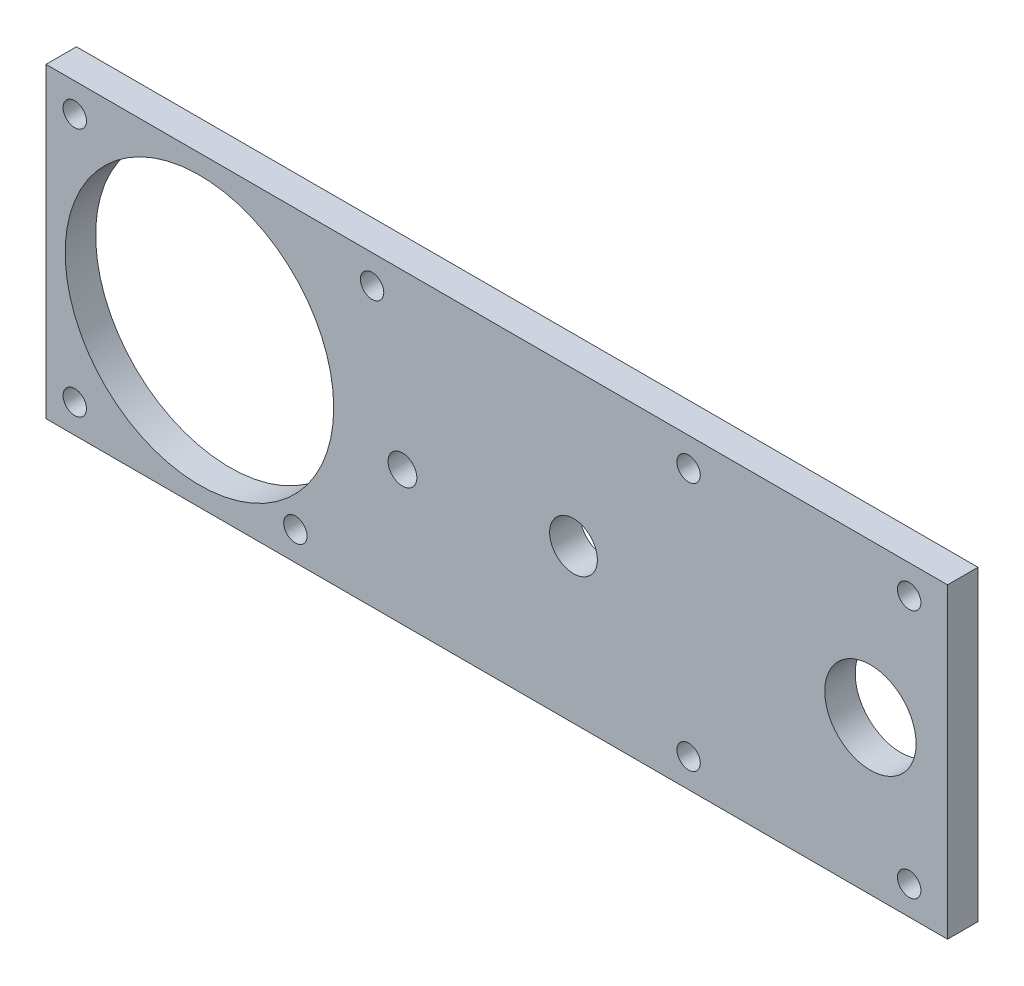
ISO-10303-21;
HEADER;
FILE_DESCRIPTION(('STEP AP214'),'2;1');
FILE_NAME('part.step','',(''),(''),'','','');
FILE_SCHEMA(('AUTOMOTIVE_DESIGN { 1 0 10303 214 1 1 1 1 }'));
ENDSEC;
DATA;
#1=APPLICATION_CONTEXT('core data for automotive mechanical design processes');
#2=APPLICATION_PROTOCOL_DEFINITION('international standard','automotive_design',2000,#1);
#3=PRODUCT_CONTEXT('',#1,'mechanical');
#4=PRODUCT('Part','Part','',(#3));
#5=PRODUCT_RELATED_PRODUCT_CATEGORY('part','',(#4));
#6=PRODUCT_DEFINITION_FORMATION('','',#4);
#7=PRODUCT_DEFINITION_CONTEXT('part definition',#1,'design');
#8=PRODUCT_DEFINITION('design','',#6,#7);
#9=PRODUCT_DEFINITION_SHAPE('','',#8);
#10=(LENGTH_UNIT() NAMED_UNIT(*) SI_UNIT(.MILLI.,.METRE.));
#11=(NAMED_UNIT(*) PLANE_ANGLE_UNIT() SI_UNIT($,.RADIAN.));
#12=(NAMED_UNIT(*) SI_UNIT($,.STERADIAN.) SOLID_ANGLE_UNIT());
#13=UNCERTAINTY_MEASURE_WITH_UNIT(LENGTH_MEASURE(1.E-05),#10,'distance_accuracy_value','');
#14=(GEOMETRIC_REPRESENTATION_CONTEXT(3) GLOBAL_UNCERTAINTY_ASSIGNED_CONTEXT((#13)) GLOBAL_UNIT_ASSIGNED_CONTEXT((#10,
#11,#12)) REPRESENTATION_CONTEXT('',''));
#15=CARTESIAN_POINT('',(0.,0.,0.));
#16=DIRECTION('',(0.,0.,1.));
#17=DIRECTION('',(1.,0.,0.));
#18=AXIS2_PLACEMENT_3D('',#15,#16,#17);
#19=CARTESIAN_POINT('',(0.,0.,-3.175));
#20=DIRECTION('',(0.,0.,1.));
#21=DIRECTION('',(-1.,0.,0.));
#22=AXIS2_PLACEMENT_3D('',#19,#20,#21);
#23=PLANE('',#22);
#24=CARTESIAN_POINT('',(85.9562,16.,-3.175));
#25=DIRECTION('',(0.,0.,1.));
#26=DIRECTION('',(1.,0.,0.));
#27=AXIS2_PLACEMENT_3D('',#24,#25,#26);
#28=CIRCLE('',#27,4.7625);
#29=CARTESIAN_POINT('',(90.7187,16.,-3.175));
#30=VERTEX_POINT('',#29);
#31=EDGE_CURVE('E179',#30,#30,#28,.T.);
#32=ORIENTED_EDGE('',*,*,#31,.T.);
#33=EDGE_LOOP('',(#32));
#34=FACE_BOUND('',#33,.T.);
#35=CARTESIAN_POINT('',(90.,3.,-3.175));
#36=DIRECTION('',(0.,0.,1.));
#37=DIRECTION('',(1.,0.,0.));
#38=AXIS2_PLACEMENT_3D('',#35,#36,#37);
#39=CIRCLE('',#38,1.2192);
#40=CARTESIAN_POINT('',(91.2192,3.,-3.175));
#41=VERTEX_POINT('',#40);
#42=EDGE_CURVE('E175',#41,#41,#39,.T.);
#43=ORIENTED_EDGE('',*,*,#42,.T.);
#44=EDGE_LOOP('',(#43));
#45=FACE_BOUND('',#44,.T.);
#46=CARTESIAN_POINT('',(90.,29.,-3.175));
#47=DIRECTION('',(0.,0.,1.));
#48=DIRECTION('',(1.,0.,0.));
#49=AXIS2_PLACEMENT_3D('',#46,#47,#48);
#50=CIRCLE('',#49,1.2192);
#51=CARTESIAN_POINT('',(91.2192,29.,-3.175));
#52=VERTEX_POINT('',#51);
#53=EDGE_CURVE('E169',#52,#52,#50,.T.);
#54=ORIENTED_EDGE('',*,*,#53,.T.);
#55=EDGE_LOOP('',(#54));
#56=FACE_BOUND('',#55,.T.);
#57=CARTESIAN_POINT('',(3.,29.,-3.175));
#58=DIRECTION('',(0.,0.,1.));
#59=DIRECTION('',(1.,0.,0.));
#60=AXIS2_PLACEMENT_3D('',#57,#58,#59);
#61=CIRCLE('',#60,1.2192);
#62=CARTESIAN_POINT('',(4.2192,29.,-3.175));
#63=VERTEX_POINT('',#62);
#64=EDGE_CURVE('E163',#63,#63,#61,.T.);
#65=ORIENTED_EDGE('',*,*,#64,.T.);
#66=EDGE_LOOP('',(#65));
#67=FACE_BOUND('',#66,.T.);
#68=CARTESIAN_POINT('',(3.,3.,-3.175));
#69=DIRECTION('',(0.,0.,1.));
#70=DIRECTION('',(1.,0.,0.));
#71=AXIS2_PLACEMENT_3D('',#68,#69,#70);
#72=CIRCLE('',#71,1.2192);
#73=CARTESIAN_POINT('',(4.2192,3.,-3.175));
#74=VERTEX_POINT('',#73);
#75=EDGE_CURVE('E157',#74,#74,#72,.T.);
#76=ORIENTED_EDGE('',*,*,#75,.T.);
#77=EDGE_LOOP('',(#76));
#78=FACE_BOUND('',#77,.T.);
#79=CARTESIAN_POINT('',(34.,29.,-3.175));
#80=DIRECTION('',(0.,0.,1.));
#81=DIRECTION('',(1.,0.,0.));
#82=AXIS2_PLACEMENT_3D('',#79,#80,#81);
#83=CIRCLE('',#82,1.2192);
#84=CARTESIAN_POINT('',(35.2192,29.,-3.175));
#85=VERTEX_POINT('',#84);
#86=EDGE_CURVE('E151',#85,#85,#83,.T.);
#87=ORIENTED_EDGE('',*,*,#86,.T.);
#88=EDGE_LOOP('',(#87));
#89=FACE_BOUND('',#88,.T.);
#90=CARTESIAN_POINT('',(26.,3.,-3.175));
#91=DIRECTION('',(0.,0.,1.));
#92=DIRECTION('',(1.,0.,0.));
#93=AXIS2_PLACEMENT_3D('',#90,#91,#92);
#94=CIRCLE('',#93,1.2192);
#95=CARTESIAN_POINT('',(27.2192,3.,-3.175));
#96=VERTEX_POINT('',#95);
#97=EDGE_CURVE('E145',#96,#96,#94,.T.);
#98=ORIENTED_EDGE('',*,*,#97,.T.);
#99=EDGE_LOOP('',(#98));
#100=FACE_BOUND('',#99,.T.);
#101=CARTESIAN_POINT('',(67.,3.,-3.175));
#102=DIRECTION('',(0.,0.,1.));
#103=DIRECTION('',(1.,0.,0.));
#104=AXIS2_PLACEMENT_3D('',#101,#102,#103);
#105=CIRCLE('',#104,1.2192);
#106=CARTESIAN_POINT('',(68.2192,3.,-3.175));
#107=VERTEX_POINT('',#106);
#108=EDGE_CURVE('E139',#107,#107,#105,.T.);
#109=ORIENTED_EDGE('',*,*,#108,.T.);
#110=EDGE_LOOP('',(#109));
#111=FACE_BOUND('',#110,.T.);
#112=CARTESIAN_POINT('',(67.,29.,-3.175));
#113=DIRECTION('',(0.,0.,1.));
#114=DIRECTION('',(1.,0.,0.));
#115=AXIS2_PLACEMENT_3D('',#112,#113,#114);
#116=CIRCLE('',#115,1.2192);
#117=CARTESIAN_POINT('',(68.2192,29.,-3.175));
#118=VERTEX_POINT('',#117);
#119=EDGE_CURVE('E133',#118,#118,#116,.T.);
#120=ORIENTED_EDGE('',*,*,#119,.T.);
#121=EDGE_LOOP('',(#120));
#122=FACE_BOUND('',#121,.T.);
#123=CARTESIAN_POINT('',(37.1666992956996,14.,-3.175));
#124=DIRECTION('',(0.,0.,1.));
#125=DIRECTION('',(1.,0.,0.));
#126=AXIS2_PLACEMENT_3D('',#123,#124,#125);
#127=CIRCLE('',#126,1.49860000000001);
#128=CARTESIAN_POINT('',(38.6652992956997,14.,-3.175));
#129=VERTEX_POINT('',#128);
#130=EDGE_CURVE('E116',#129,#129,#127,.T.);
#131=ORIENTED_EDGE('',*,*,#130,.T.);
#132=EDGE_LOOP('',(#131));
#133=FACE_BOUND('',#132,.T.);
#134=DIRECTION('',(0.,-1.,0.));
#135=VECTOR('',#134,1.);
#136=CARTESIAN_POINT('',(0.,0.,-3.175));
#137=LINE('',#136,#135);
#138=CARTESIAN_POINT('',(0.,32.,-3.175));
#139=VERTEX_POINT('',#138);
#140=CARTESIAN_POINT('',(0.,0.,-3.175));
#141=VERTEX_POINT('',#140);
#142=EDGE_CURVE('E93',#139,#141,#137,.T.);
#143=ORIENTED_EDGE('',*,*,#142,.F.);
#144=DIRECTION('',(-1.,0.,0.));
#145=VECTOR('',#144,1.);
#146=CARTESIAN_POINT('',(0.,32.,-3.175));
#147=LINE('',#146,#145);
#148=CARTESIAN_POINT('',(93.9999999599999,32.,-3.175));
#149=VERTEX_POINT('',#148);
#150=EDGE_CURVE('E96',#149,#139,#147,.T.);
#151=ORIENTED_EDGE('',*,*,#150,.F.);
#152=DIRECTION('',(0.,1.,0.));
#153=VECTOR('',#152,1.);
#154=CARTESIAN_POINT('',(93.9999999599999,0.,-3.175));
#155=LINE('',#154,#153);
#156=CARTESIAN_POINT('',(93.9999999599999,0.,-3.175));
#157=VERTEX_POINT('',#156);
#158=EDGE_CURVE('E84',#157,#149,#155,.T.);
#159=ORIENTED_EDGE('',*,*,#158,.F.);
#160=DIRECTION('',(1.,0.,0.));
#161=VECTOR('',#160,1.);
#162=CARTESIAN_POINT('',(0.,0.,-3.175));
#163=LINE('',#162,#161);
#164=EDGE_CURVE('E89',#141,#157,#163,.T.);
#165=ORIENTED_EDGE('',*,*,#164,.F.);
#166=EDGE_LOOP('',(#143,#151,#159,#165));
#167=FACE_BOUND('',#166,.T.);
#168=CARTESIAN_POINT('',(55.,16.,-3.175));
#169=DIRECTION('',(0.,0.,1.));
#170=DIRECTION('',(1.,0.,0.));
#171=AXIS2_PLACEMENT_3D('',#168,#169,#170);
#172=CIRCLE('',#171,2.4892);
#173=CARTESIAN_POINT('',(57.4892,16.,-3.175));
#174=VERTEX_POINT('',#173);
#175=EDGE_CURVE('E105',#174,#174,#172,.T.);
#176=ORIENTED_EDGE('',*,*,#175,.T.);
#177=EDGE_LOOP('',(#176));
#178=FACE_BOUND('',#177,.T.);
#179=CARTESIAN_POINT('',(16.,16.,-3.175));
#180=DIRECTION('',(0.,0.,1.));
#181=DIRECTION('',(1.,0.,0.));
#182=AXIS2_PLACEMENT_3D('',#179,#180,#181);
#183=CIRCLE('',#182,14.);
#184=CARTESIAN_POINT('',(30.,16.,-3.175));
#185=VERTEX_POINT('',#184);
#186=EDGE_CURVE('E122',#185,#185,#183,.T.);
#187=ORIENTED_EDGE('',*,*,#186,.T.);
#188=EDGE_LOOP('',(#187));
#189=FACE_BOUND('',#188,.T.);
#190=ADVANCED_FACE('F37',(#34,#45,#56,#67,#78,#89,#100,#111,#122,#133,#167,#178,#189),#23,.F.);
#191=CARTESIAN_POINT('',(0.,0.,0.));
#192=DIRECTION('',(0.,0.,1.));
#193=DIRECTION('',(-1.,0.,0.));
#194=AXIS2_PLACEMENT_3D('',#191,#192,#193);
#195=PLANE('',#194);
#196=CARTESIAN_POINT('',(85.9562,16.,0.));
#197=DIRECTION('',(0.,0.,1.));
#198=DIRECTION('',(1.,0.,0.));
#199=AXIS2_PLACEMENT_3D('',#196,#197,#198);
#200=CIRCLE('',#199,4.7625);
#201=CARTESIAN_POINT('',(90.7187,16.,0.));
#202=VERTEX_POINT('',#201);
#203=EDGE_CURVE('E178',#202,#202,#200,.T.);
#204=ORIENTED_EDGE('',*,*,#203,.F.);
#205=EDGE_LOOP('',(#204));
#206=FACE_BOUND('',#205,.T.);
#207=CARTESIAN_POINT('',(90.,3.,0.));
#208=DIRECTION('',(0.,0.,1.));
#209=DIRECTION('',(1.,0.,0.));
#210=AXIS2_PLACEMENT_3D('',#207,#208,#209);
#211=CIRCLE('',#210,1.2192);
#212=CARTESIAN_POINT('',(91.2192,3.,0.));
#213=VERTEX_POINT('',#212);
#214=EDGE_CURVE('E172',#213,#213,#211,.T.);
#215=ORIENTED_EDGE('',*,*,#214,.F.);
#216=EDGE_LOOP('',(#215));
#217=FACE_BOUND('',#216,.T.);
#218=CARTESIAN_POINT('',(90.,29.,0.));
#219=DIRECTION('',(0.,0.,1.));
#220=DIRECTION('',(1.,0.,0.));
#221=AXIS2_PLACEMENT_3D('',#218,#219,#220);
#222=CIRCLE('',#221,1.2192);
#223=CARTESIAN_POINT('',(91.2192,29.,0.));
#224=VERTEX_POINT('',#223);
#225=EDGE_CURVE('E166',#224,#224,#222,.T.);
#226=ORIENTED_EDGE('',*,*,#225,.F.);
#227=EDGE_LOOP('',(#226));
#228=FACE_BOUND('',#227,.T.);
#229=CARTESIAN_POINT('',(3.,29.,0.));
#230=DIRECTION('',(0.,0.,1.));
#231=DIRECTION('',(1.,0.,0.));
#232=AXIS2_PLACEMENT_3D('',#229,#230,#231);
#233=CIRCLE('',#232,1.2192);
#234=CARTESIAN_POINT('',(4.2192,29.,0.));
#235=VERTEX_POINT('',#234);
#236=EDGE_CURVE('E160',#235,#235,#233,.T.);
#237=ORIENTED_EDGE('',*,*,#236,.F.);
#238=EDGE_LOOP('',(#237));
#239=FACE_BOUND('',#238,.T.);
#240=CARTESIAN_POINT('',(3.,3.,0.));
#241=DIRECTION('',(0.,0.,1.));
#242=DIRECTION('',(1.,0.,0.));
#243=AXIS2_PLACEMENT_3D('',#240,#241,#242);
#244=CIRCLE('',#243,1.2192);
#245=CARTESIAN_POINT('',(4.2192,3.,0.));
#246=VERTEX_POINT('',#245);
#247=EDGE_CURVE('E154',#246,#246,#244,.T.);
#248=ORIENTED_EDGE('',*,*,#247,.F.);
#249=EDGE_LOOP('',(#248));
#250=FACE_BOUND('',#249,.T.);
#251=CARTESIAN_POINT('',(34.,29.,0.));
#252=DIRECTION('',(0.,0.,1.));
#253=DIRECTION('',(1.,0.,0.));
#254=AXIS2_PLACEMENT_3D('',#251,#252,#253);
#255=CIRCLE('',#254,1.2192);
#256=CARTESIAN_POINT('',(35.2192,29.,0.));
#257=VERTEX_POINT('',#256);
#258=EDGE_CURVE('E148',#257,#257,#255,.T.);
#259=ORIENTED_EDGE('',*,*,#258,.F.);
#260=EDGE_LOOP('',(#259));
#261=FACE_BOUND('',#260,.T.);
#262=CARTESIAN_POINT('',(26.,3.,0.));
#263=DIRECTION('',(0.,0.,1.));
#264=DIRECTION('',(1.,0.,0.));
#265=AXIS2_PLACEMENT_3D('',#262,#263,#264);
#266=CIRCLE('',#265,1.2192);
#267=CARTESIAN_POINT('',(27.2192,3.,0.));
#268=VERTEX_POINT('',#267);
#269=EDGE_CURVE('E142',#268,#268,#266,.T.);
#270=ORIENTED_EDGE('',*,*,#269,.F.);
#271=EDGE_LOOP('',(#270));
#272=FACE_BOUND('',#271,.T.);
#273=CARTESIAN_POINT('',(67.,3.,0.));
#274=DIRECTION('',(0.,0.,1.));
#275=DIRECTION('',(1.,0.,0.));
#276=AXIS2_PLACEMENT_3D('',#273,#274,#275);
#277=CIRCLE('',#276,1.2192);
#278=CARTESIAN_POINT('',(68.2192,3.,0.));
#279=VERTEX_POINT('',#278);
#280=EDGE_CURVE('E136',#279,#279,#277,.T.);
#281=ORIENTED_EDGE('',*,*,#280,.F.);
#282=EDGE_LOOP('',(#281));
#283=FACE_BOUND('',#282,.T.);
#284=CARTESIAN_POINT('',(67.,29.,0.));
#285=DIRECTION('',(0.,0.,1.));
#286=DIRECTION('',(1.,0.,0.));
#287=AXIS2_PLACEMENT_3D('',#284,#285,#286);
#288=CIRCLE('',#287,1.2192);
#289=CARTESIAN_POINT('',(68.2192,29.,0.));
#290=VERTEX_POINT('',#289);
#291=EDGE_CURVE('E128',#290,#290,#288,.T.);
#292=ORIENTED_EDGE('',*,*,#291,.F.);
#293=EDGE_LOOP('',(#292));
#294=FACE_BOUND('',#293,.T.);
#295=CARTESIAN_POINT('',(37.1666992956996,14.,0.));
#296=DIRECTION('',(0.,0.,1.));
#297=DIRECTION('',(1.,0.,0.));
#298=AXIS2_PLACEMENT_3D('',#295,#296,#297);
#299=CIRCLE('',#298,1.49860000000001);
#300=CARTESIAN_POINT('',(38.6652992956997,14.,0.));
#301=VERTEX_POINT('',#300);
#302=EDGE_CURVE('E119',#301,#301,#299,.T.);
#303=ORIENTED_EDGE('',*,*,#302,.F.);
#304=EDGE_LOOP('',(#303));
#305=FACE_BOUND('',#304,.T.);
#306=DIRECTION('',(0.,-1.,0.));
#307=VECTOR('',#306,1.);
#308=CARTESIAN_POINT('',(0.,0.,0.));
#309=LINE('',#308,#307);
#310=CARTESIAN_POINT('',(0.,32.,0.));
#311=VERTEX_POINT('',#310);
#312=CARTESIAN_POINT('',(0.,0.,0.));
#313=VERTEX_POINT('',#312);
#314=EDGE_CURVE('E101',#311,#313,#309,.T.);
#315=ORIENTED_EDGE('',*,*,#314,.T.);
#316=DIRECTION('',(1.,0.,0.));
#317=VECTOR('',#316,1.);
#318=CARTESIAN_POINT('',(0.,0.,0.));
#319=LINE('',#318,#317);
#320=CARTESIAN_POINT('',(93.9999999599999,0.,0.));
#321=VERTEX_POINT('',#320);
#322=EDGE_CURVE('E104',#313,#321,#319,.T.);
#323=ORIENTED_EDGE('',*,*,#322,.T.);
#324=DIRECTION('',(0.,1.,0.));
#325=VECTOR('',#324,1.);
#326=CARTESIAN_POINT('',(93.9999999599999,0.,0.));
#327=LINE('',#326,#325);
#328=CARTESIAN_POINT('',(93.9999999599999,32.,0.));
#329=VERTEX_POINT('',#328);
#330=EDGE_CURVE('E87',#321,#329,#327,.T.);
#331=ORIENTED_EDGE('',*,*,#330,.T.);
#332=DIRECTION('',(-1.,0.,0.));
#333=VECTOR('',#332,1.);
#334=CARTESIAN_POINT('',(0.,32.,0.));
#335=LINE('',#334,#333);
#336=EDGE_CURVE('E108',#329,#311,#335,.T.);
#337=ORIENTED_EDGE('',*,*,#336,.T.);
#338=EDGE_LOOP('',(#315,#323,#331,#337));
#339=FACE_BOUND('',#338,.T.);
#340=CARTESIAN_POINT('',(55.,16.,0.));
#341=DIRECTION('',(0.,0.,1.));
#342=DIRECTION('',(1.,0.,0.));
#343=AXIS2_PLACEMENT_3D('',#340,#341,#342);
#344=CIRCLE('',#343,2.4892);
#345=CARTESIAN_POINT('',(57.4892,16.,0.));
#346=VERTEX_POINT('',#345);
#347=EDGE_CURVE('E113',#346,#346,#344,.T.);
#348=ORIENTED_EDGE('',*,*,#347,.F.);
#349=EDGE_LOOP('',(#348));
#350=FACE_BOUND('',#349,.T.);
#351=CARTESIAN_POINT('',(16.,16.,0.));
#352=DIRECTION('',(0.,0.,1.));
#353=DIRECTION('',(1.,0.,0.));
#354=AXIS2_PLACEMENT_3D('',#351,#352,#353);
#355=CIRCLE('',#354,14.);
#356=CARTESIAN_POINT('',(30.,16.,0.));
#357=VERTEX_POINT('',#356);
#358=EDGE_CURVE('E125',#357,#357,#355,.T.);
#359=ORIENTED_EDGE('',*,*,#358,.F.);
#360=EDGE_LOOP('',(#359));
#361=FACE_BOUND('',#360,.T.);
#362=ADVANCED_FACE('F188',(#206,#217,#228,#239,#250,#261,#272,#283,#294,#305,#339,#350,#361),
#195,.T.);
#363=CARTESIAN_POINT('',(0.,0.,-3.175));
#364=DIRECTION('',(1.,0.,0.));
#365=DIRECTION('',(0.,1.,0.));
#366=AXIS2_PLACEMENT_3D('',#363,#364,#365);
#367=PLANE('',#366);
#368=ORIENTED_EDGE('',*,*,#314,.F.);
#369=DIRECTION('',(0.,0.,1.));
#370=VECTOR('',#369,1.);
#371=CARTESIAN_POINT('',(0.,32.,-3.175));
#372=LINE('',#371,#370);
#373=EDGE_CURVE('E54',#139,#311,#372,.T.);
#374=ORIENTED_EDGE('',*,*,#373,.F.);
#375=ORIENTED_EDGE('',*,*,#142,.T.);
#376=DIRECTION('',(0.,0.,1.));
#377=VECTOR('',#376,1.);
#378=CARTESIAN_POINT('',(0.,0.,-3.175));
#379=LINE('',#378,#377);
#380=EDGE_CURVE('E11',#141,#313,#379,.T.);
#381=ORIENTED_EDGE('',*,*,#380,.T.);
#382=EDGE_LOOP('',(#368,#374,#375,#381));
#383=FACE_BOUND('',#382,.T.);
#384=ADVANCED_FACE('F39',(#383),#367,.F.);
#385=CARTESIAN_POINT('',(0.,0.,-3.175));
#386=DIRECTION('',(0.,1.,0.));
#387=DIRECTION('',(0.,0.,-1.));
#388=AXIS2_PLACEMENT_3D('',#385,#386,#387);
#389=PLANE('',#388);
#390=ORIENTED_EDGE('',*,*,#322,.F.);
#391=ORIENTED_EDGE('',*,*,#380,.F.);
#392=ORIENTED_EDGE('',*,*,#164,.T.);
#393=DIRECTION('',(0.,0.,1.));
#394=VECTOR('',#393,1.);
#395=CARTESIAN_POINT('',(93.9999999599999,0.,-3.175));
#396=LINE('',#395,#394);
#397=EDGE_CURVE('E46',#157,#321,#396,.T.);
#398=ORIENTED_EDGE('',*,*,#397,.T.);
#399=EDGE_LOOP('',(#390,#391,#392,#398));
#400=FACE_BOUND('',#399,.T.);
#401=ADVANCED_FACE('F90',(#400),#389,.F.);
#402=CARTESIAN_POINT('',(93.9999999599999,0.,-3.175));
#403=DIRECTION('',(-1.,0.,0.));
#404=DIRECTION('',(0.,0.,-1.));
#405=AXIS2_PLACEMENT_3D('',#402,#403,#404);
#406=PLANE('',#405);
#407=ORIENTED_EDGE('',*,*,#330,.F.);
#408=ORIENTED_EDGE('',*,*,#397,.F.);
#409=ORIENTED_EDGE('',*,*,#158,.T.);
#410=DIRECTION('',(0.,0.,1.));
#411=VECTOR('',#410,1.);
#412=CARTESIAN_POINT('',(93.9999999599999,32.,-3.175));
#413=LINE('',#412,#411);
#414=EDGE_CURVE('E70',#149,#329,#413,.T.);
#415=ORIENTED_EDGE('',*,*,#414,.T.);
#416=EDGE_LOOP('',(#407,#408,#409,#415));
#417=FACE_BOUND('',#416,.T.);
#418=ADVANCED_FACE('F82',(#417),#406,.F.);
#419=CARTESIAN_POINT('',(0.,32.,-3.175));
#420=DIRECTION('',(0.,-1.,0.));
#421=DIRECTION('',(1.,0.,0.));
#422=AXIS2_PLACEMENT_3D('',#419,#420,#421);
#423=PLANE('',#422);
#424=ORIENTED_EDGE('',*,*,#336,.F.);
#425=ORIENTED_EDGE('',*,*,#414,.F.);
#426=ORIENTED_EDGE('',*,*,#150,.T.);
#427=ORIENTED_EDGE('',*,*,#373,.T.);
#428=EDGE_LOOP('',(#424,#425,#426,#427));
#429=FACE_BOUND('',#428,.T.);
#430=ADVANCED_FACE('F239',(#429),#423,.F.);
#431=CARTESIAN_POINT('',(55.,16.,-3.175));
#432=DIRECTION('',(0.,0.,1.));
#433=DIRECTION('',(-1.,0.,0.));
#434=AXIS2_PLACEMENT_3D('',#431,#432,#433);
#435=CYLINDRICAL_SURFACE('',#434,2.4892);
#436=ORIENTED_EDGE('',*,*,#175,.F.);
#437=EDGE_LOOP('',(#436));
#438=FACE_BOUND('',#437,.T.);
#439=ORIENTED_EDGE('',*,*,#347,.T.);
#440=EDGE_LOOP('',(#439));
#441=FACE_BOUND('',#440,.T.);
#442=ADVANCED_FACE('F227',(#438,#441),#435,.F.);
#443=CARTESIAN_POINT('',(37.1666992956996,14.,-3.175));
#444=DIRECTION('',(0.,0.,1.));
#445=DIRECTION('',(-1.,0.,0.));
#446=AXIS2_PLACEMENT_3D('',#443,#444,#445);
#447=CYLINDRICAL_SURFACE('',#446,1.49860000000001);
#448=ORIENTED_EDGE('',*,*,#130,.F.);
#449=EDGE_LOOP('',(#448));
#450=FACE_BOUND('',#449,.T.);
#451=ORIENTED_EDGE('',*,*,#302,.T.);
#452=EDGE_LOOP('',(#451));
#453=FACE_BOUND('',#452,.T.);
#454=ADVANCED_FACE('F217',(#450,#453),#447,.F.);
#455=CARTESIAN_POINT('',(16.,16.,-3.175));
#456=DIRECTION('',(0.,0.,1.));
#457=DIRECTION('',(-1.,0.,0.));
#458=AXIS2_PLACEMENT_3D('',#455,#456,#457);
#459=CYLINDRICAL_SURFACE('',#458,14.);
#460=ORIENTED_EDGE('',*,*,#186,.F.);
#461=EDGE_LOOP('',(#460));
#462=FACE_BOUND('',#461,.T.);
#463=ORIENTED_EDGE('',*,*,#358,.T.);
#464=EDGE_LOOP('',(#463));
#465=FACE_BOUND('',#464,.T.);
#466=ADVANCED_FACE('F214',(#462,#465),#459,.F.);
#467=CARTESIAN_POINT('',(67.,29.,-3.175));
#468=DIRECTION('',(0.,0.,-1.));
#469=DIRECTION('',(1.,0.,0.));
#470=AXIS2_PLACEMENT_3D('',#467,#468,#469);
#471=CYLINDRICAL_SURFACE('',#470,1.2192);
#472=ORIENTED_EDGE('',*,*,#291,.T.);
#473=EDGE_LOOP('',(#472));
#474=FACE_BOUND('',#473,.T.);
#475=ORIENTED_EDGE('',*,*,#119,.F.);
#476=EDGE_LOOP('',(#475));
#477=FACE_BOUND('',#476,.T.);
#478=ADVANCED_FACE('F216',(#474,#477),#471,.F.);
#479=CARTESIAN_POINT('',(67.,3.,-3.175));
#480=DIRECTION('',(0.,0.,-1.));
#481=DIRECTION('',(1.,0.,0.));
#482=AXIS2_PLACEMENT_3D('',#479,#480,#481);
#483=CYLINDRICAL_SURFACE('',#482,1.2192);
#484=ORIENTED_EDGE('',*,*,#280,.T.);
#485=EDGE_LOOP('',(#484));
#486=FACE_BOUND('',#485,.T.);
#487=ORIENTED_EDGE('',*,*,#108,.F.);
#488=EDGE_LOOP('',(#487));
#489=FACE_BOUND('',#488,.T.);
#490=ADVANCED_FACE('F224',(#486,#489),#483,.F.);
#491=CARTESIAN_POINT('',(26.,3.,-3.175));
#492=DIRECTION('',(0.,0.,-1.));
#493=DIRECTION('',(1.,0.,0.));
#494=AXIS2_PLACEMENT_3D('',#491,#492,#493);
#495=CYLINDRICAL_SURFACE('',#494,1.2192);
#496=ORIENTED_EDGE('',*,*,#269,.T.);
#497=EDGE_LOOP('',(#496));
#498=FACE_BOUND('',#497,.T.);
#499=ORIENTED_EDGE('',*,*,#97,.F.);
#500=EDGE_LOOP('',(#499));
#501=FACE_BOUND('',#500,.T.);
#502=ADVANCED_FACE('F304',(#498,#501),#495,.F.);
#503=CARTESIAN_POINT('',(34.,29.,-3.175));
#504=DIRECTION('',(0.,0.,-1.));
#505=DIRECTION('',(1.,0.,0.));
#506=AXIS2_PLACEMENT_3D('',#503,#504,#505);
#507=CYLINDRICAL_SURFACE('',#506,1.2192);
#508=ORIENTED_EDGE('',*,*,#258,.T.);
#509=EDGE_LOOP('',(#508));
#510=FACE_BOUND('',#509,.T.);
#511=ORIENTED_EDGE('',*,*,#86,.F.);
#512=EDGE_LOOP('',(#511));
#513=FACE_BOUND('',#512,.T.);
#514=ADVANCED_FACE('F313',(#510,#513),#507,.F.);
#515=CARTESIAN_POINT('',(3.,3.,-3.175));
#516=DIRECTION('',(0.,0.,-1.));
#517=DIRECTION('',(1.,0.,0.));
#518=AXIS2_PLACEMENT_3D('',#515,#516,#517);
#519=CYLINDRICAL_SURFACE('',#518,1.2192);
#520=ORIENTED_EDGE('',*,*,#247,.T.);
#521=EDGE_LOOP('',(#520));
#522=FACE_BOUND('',#521,.T.);
#523=ORIENTED_EDGE('',*,*,#75,.F.);
#524=EDGE_LOOP('',(#523));
#525=FACE_BOUND('',#524,.T.);
#526=ADVANCED_FACE('F322',(#522,#525),#519,.F.);
#527=CARTESIAN_POINT('',(3.,29.,-3.175));
#528=DIRECTION('',(0.,0.,-1.));
#529=DIRECTION('',(1.,0.,0.));
#530=AXIS2_PLACEMENT_3D('',#527,#528,#529);
#531=CYLINDRICAL_SURFACE('',#530,1.2192);
#532=ORIENTED_EDGE('',*,*,#236,.T.);
#533=EDGE_LOOP('',(#532));
#534=FACE_BOUND('',#533,.T.);
#535=ORIENTED_EDGE('',*,*,#64,.F.);
#536=EDGE_LOOP('',(#535));
#537=FACE_BOUND('',#536,.T.);
#538=ADVANCED_FACE('F331',(#534,#537),#531,.F.);
#539=CARTESIAN_POINT('',(90.,29.,-3.175));
#540=DIRECTION('',(0.,0.,-1.));
#541=DIRECTION('',(1.,0.,0.));
#542=AXIS2_PLACEMENT_3D('',#539,#540,#541);
#543=CYLINDRICAL_SURFACE('',#542,1.2192);
#544=ORIENTED_EDGE('',*,*,#225,.T.);
#545=EDGE_LOOP('',(#544));
#546=FACE_BOUND('',#545,.T.);
#547=ORIENTED_EDGE('',*,*,#53,.F.);
#548=EDGE_LOOP('',(#547));
#549=FACE_BOUND('',#548,.T.);
#550=ADVANCED_FACE('F340',(#546,#549),#543,.F.);
#551=CARTESIAN_POINT('',(90.,3.,-3.175));
#552=DIRECTION('',(0.,0.,-1.));
#553=DIRECTION('',(1.,0.,0.));
#554=AXIS2_PLACEMENT_3D('',#551,#552,#553);
#555=CYLINDRICAL_SURFACE('',#554,1.2192);
#556=ORIENTED_EDGE('',*,*,#214,.T.);
#557=EDGE_LOOP('',(#556));
#558=FACE_BOUND('',#557,.T.);
#559=ORIENTED_EDGE('',*,*,#42,.F.);
#560=EDGE_LOOP('',(#559));
#561=FACE_BOUND('',#560,.T.);
#562=ADVANCED_FACE('F349',(#558,#561),#555,.F.);
#563=CARTESIAN_POINT('',(85.9562,16.,0.));
#564=DIRECTION('',(0.,0.,-1.));
#565=DIRECTION('',(1.,0.,0.));
#566=AXIS2_PLACEMENT_3D('',#563,#564,#565);
#567=CYLINDRICAL_SURFACE('',#566,4.7625);
#568=ORIENTED_EDGE('',*,*,#203,.T.);
#569=EDGE_LOOP('',(#568));
#570=FACE_BOUND('',#569,.T.);
#571=ORIENTED_EDGE('',*,*,#31,.F.);
#572=EDGE_LOOP('',(#571));
#573=FACE_BOUND('',#572,.T.);
#574=ADVANCED_FACE('F185',(#570,#573),#567,.F.);
#575=CLOSED_SHELL('',(#190,#362,#384,#401,#418,#430,#442,#454,#466,#478,#490,#502,#514,#526,
#538,#550,#562,#574));
#576=MANIFOLD_SOLID_BREP('B2',#575);
#577=ADVANCED_BREP_SHAPE_REPRESENTATION('',(#18,#576),#14);
#578=SHAPE_DEFINITION_REPRESENTATION(#9,#577);
ENDSEC;
END-ISO-10303-21;
